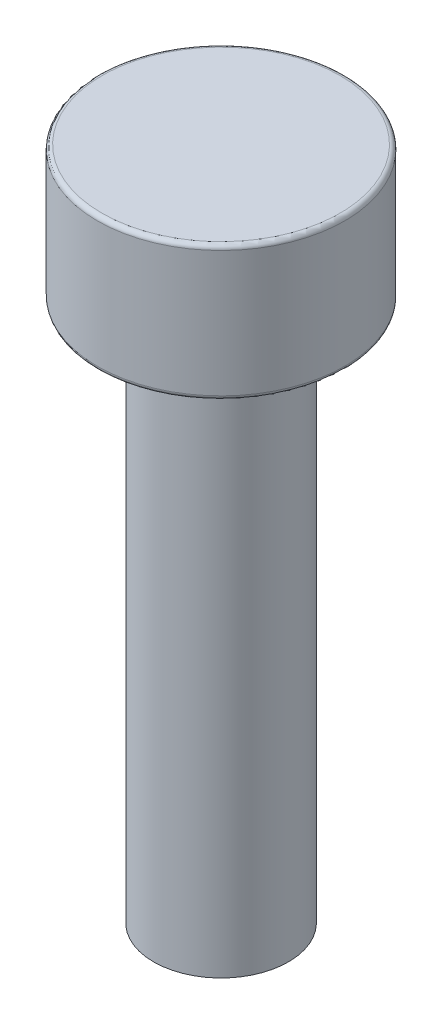
ISO-10303-21;
HEADER;
FILE_DESCRIPTION(('STEP AP214'),'2;1');
FILE_NAME('part.step','',(''),(''),'','','');
FILE_SCHEMA(('AUTOMOTIVE_DESIGN { 1 0 10303 214 1 1 1 1 }'));
ENDSEC;
DATA;
#1=APPLICATION_CONTEXT('core data for automotive mechanical design processes');
#2=APPLICATION_PROTOCOL_DEFINITION('international standard','automotive_design',2000,#1);
#3=PRODUCT_CONTEXT('',#1,'mechanical');
#4=PRODUCT('Part','Part','',(#3));
#5=PRODUCT_RELATED_PRODUCT_CATEGORY('part','',(#4));
#6=PRODUCT_DEFINITION_FORMATION('','',#4);
#7=PRODUCT_DEFINITION_CONTEXT('part definition',#1,'design');
#8=PRODUCT_DEFINITION('design','',#6,#7);
#9=PRODUCT_DEFINITION_SHAPE('','',#8);
#10=(LENGTH_UNIT() NAMED_UNIT(*) SI_UNIT(.MILLI.,.METRE.));
#11=(NAMED_UNIT(*) PLANE_ANGLE_UNIT() SI_UNIT($,.RADIAN.));
#12=(NAMED_UNIT(*) SI_UNIT($,.STERADIAN.) SOLID_ANGLE_UNIT());
#13=UNCERTAINTY_MEASURE_WITH_UNIT(LENGTH_MEASURE(1.E-05),#10,'distance_accuracy_value','');
#14=(GEOMETRIC_REPRESENTATION_CONTEXT(3) GLOBAL_UNCERTAINTY_ASSIGNED_CONTEXT((#13)) GLOBAL_UNIT_ASSIGNED_CONTEXT((#10,
#11,#12)) REPRESENTATION_CONTEXT('',''));
#15=CARTESIAN_POINT('',(0.,0.,0.));
#16=DIRECTION('',(0.,0.,1.));
#17=DIRECTION('',(1.,0.,0.));
#18=AXIS2_PLACEMENT_3D('',#15,#16,#17);
#19=CARTESIAN_POINT('',(0.,12.,0.));
#20=DIRECTION('',(0.,-1.,0.));
#21=DIRECTION('',(0.,0.,-1.));
#22=AXIS2_PLACEMENT_3D('',#19,#20,#21);
#23=CYLINDRICAL_SURFACE('',#22,1.5);
#24=CARTESIAN_POINT('',(0.,11.8,0.));
#25=DIRECTION('',(0.,1.,0.));
#26=DIRECTION('',(0.,0.,1.));
#27=AXIS2_PLACEMENT_3D('',#24,#25,#26);
#28=CIRCLE('',#27,1.5);
#29=CARTESIAN_POINT('',(0.,11.8,1.5));
#30=VERTEX_POINT('',#29);
#31=EDGE_CURVE('E57',#30,#30,#28,.F.);
#32=ORIENTED_EDGE('',*,*,#31,.T.);
#33=EDGE_LOOP('',(#32));
#34=FACE_BOUND('',#33,.T.);
#35=CARTESIAN_POINT('',(0.,0.,0.));
#36=DIRECTION('',(0.,1.,0.));
#37=DIRECTION('',(0.,0.,1.));
#38=AXIS2_PLACEMENT_3D('',#35,#36,#37);
#39=CIRCLE('',#38,1.5);
#40=CARTESIAN_POINT('',(0.,0.,1.5));
#41=VERTEX_POINT('',#40);
#42=EDGE_CURVE('E63',#41,#41,#39,.T.);
#43=ORIENTED_EDGE('',*,*,#42,.T.);
#44=EDGE_LOOP('',(#43));
#45=FACE_BOUND('',#44,.T.);
#46=ADVANCED_FACE('F37',(#34,#45),#23,.T.);
#47=CARTESIAN_POINT('',(0.,0.,0.));
#48=DIRECTION('',(0.,1.,0.));
#49=DIRECTION('',(0.,0.,1.));
#50=AXIS2_PLACEMENT_3D('',#47,#48,#49);
#51=PLANE('',#50);
#52=ORIENTED_EDGE('',*,*,#42,.F.);
#53=EDGE_LOOP('',(#52));
#54=FACE_BOUND('',#53,.T.);
#55=ADVANCED_FACE('F68',(#54),#51,.F.);
#56=CARTESIAN_POINT('',(0.,15.,0.));
#57=DIRECTION('',(0.,-1.,0.));
#58=DIRECTION('',(0.,0.,-1.));
#59=AXIS2_PLACEMENT_3D('',#56,#57,#58);
#60=CYLINDRICAL_SURFACE('',#59,2.75);
#61=CARTESIAN_POINT('',(0.,12.1,0.));
#62=DIRECTION('',(0.,1.,0.));
#63=DIRECTION('',(0.,0.,1.));
#64=AXIS2_PLACEMENT_3D('',#61,#62,#63);
#65=CIRCLE('',#64,2.75);
#66=CARTESIAN_POINT('',(0.,12.1,2.75));
#67=VERTEX_POINT('',#66);
#68=EDGE_CURVE('E44',#67,#67,#65,.T.);
#69=ORIENTED_EDGE('',*,*,#68,.T.);
#70=EDGE_LOOP('',(#69));
#71=FACE_BOUND('',#70,.T.);
#72=CARTESIAN_POINT('',(0.,14.9,0.));
#73=DIRECTION('',(0.,1.,0.));
#74=DIRECTION('',(0.,0.,1.));
#75=AXIS2_PLACEMENT_3D('',#72,#73,#74);
#76=CIRCLE('',#75,2.75);
#77=CARTESIAN_POINT('',(0.,14.9,2.75));
#78=VERTEX_POINT('',#77);
#79=EDGE_CURVE('E48',#78,#78,#76,.F.);
#80=ORIENTED_EDGE('',*,*,#79,.T.);
#81=EDGE_LOOP('',(#80));
#82=FACE_BOUND('',#81,.T.);
#83=ADVANCED_FACE('F70',(#71,#82),#60,.T.);
#84=CARTESIAN_POINT('',(0.,15.,0.));
#85=DIRECTION('',(0.,1.,0.));
#86=DIRECTION('',(0.,0.,1.));
#87=AXIS2_PLACEMENT_3D('',#84,#85,#86);
#88=PLANE('',#87);
#89=CARTESIAN_POINT('',(0.,15.,0.));
#90=DIRECTION('',(0.,1.,0.));
#91=DIRECTION('',(0.,0.,1.));
#92=AXIS2_PLACEMENT_3D('',#89,#90,#91);
#93=CIRCLE('',#92,2.65);
#94=CARTESIAN_POINT('',(0.,15.,2.65));
#95=VERTEX_POINT('',#94);
#96=EDGE_CURVE('E52',#95,#95,#93,.T.);
#97=ORIENTED_EDGE('',*,*,#96,.T.);
#98=EDGE_LOOP('',(#97));
#99=FACE_BOUND('',#98,.T.);
#100=ADVANCED_FACE('F76',(#99),#88,.T.);
#101=CARTESIAN_POINT('',(0.,12.,0.));
#102=DIRECTION('',(0.,1.,0.));
#103=DIRECTION('',(0.,0.,1.));
#104=AXIS2_PLACEMENT_3D('',#101,#102,#103);
#105=PLANE('',#104);
#106=CARTESIAN_POINT('',(0.,12.,0.));
#107=DIRECTION('',(0.,1.,0.));
#108=DIRECTION('',(0.,0.,1.));
#109=AXIS2_PLACEMENT_3D('',#106,#107,#108);
#110=CIRCLE('',#109,2.65);
#111=CARTESIAN_POINT('',(0.,12.,2.65));
#112=VERTEX_POINT('',#111);
#113=EDGE_CURVE('E10',#112,#112,#110,.F.);
#114=ORIENTED_EDGE('',*,*,#113,.T.);
#115=EDGE_LOOP('',(#114));
#116=FACE_BOUND('',#115,.T.);
#117=CARTESIAN_POINT('',(0.,12.,0.));
#118=DIRECTION('',(0.,1.,0.));
#119=DIRECTION('',(0.,0.,1.));
#120=AXIS2_PLACEMENT_3D('',#117,#118,#119);
#121=CIRCLE('',#120,1.7);
#122=CARTESIAN_POINT('',(0.,12.,1.7));
#123=VERTEX_POINT('',#122);
#124=EDGE_CURVE('E60',#123,#123,#121,.T.);
#125=ORIENTED_EDGE('',*,*,#124,.T.);
#126=EDGE_LOOP('',(#125));
#127=FACE_BOUND('',#126,.T.);
#128=ADVANCED_FACE('F85',(#116,#127),#105,.F.);
#129=CARTESIAN_POINT('',(0.,11.8,0.));
#130=DIRECTION('',(0.,1.,0.));
#131=DIRECTION('',(0.,0.,1.));
#132=AXIS2_PLACEMENT_3D('',#129,#130,#131);
#133=TOROIDAL_SURFACE('',#132,1.7,0.2);
#134=ORIENTED_EDGE('',*,*,#31,.F.);
#135=EDGE_LOOP('',(#134));
#136=FACE_BOUND('',#135,.T.);
#137=ORIENTED_EDGE('',*,*,#124,.F.);
#138=EDGE_LOOP('',(#137));
#139=FACE_BOUND('',#138,.T.);
#140=ADVANCED_FACE('F82',(#136,#139),#133,.F.);
#141=CARTESIAN_POINT('',(0.,14.9,0.));
#142=DIRECTION('',(0.,1.,0.));
#143=DIRECTION('',(0.,0.,1.));
#144=AXIS2_PLACEMENT_3D('',#141,#142,#143);
#145=TOROIDAL_SURFACE('',#144,2.65,0.1);
#146=ORIENTED_EDGE('',*,*,#79,.F.);
#147=EDGE_LOOP('',(#146));
#148=FACE_BOUND('',#147,.T.);
#149=ORIENTED_EDGE('',*,*,#96,.F.);
#150=EDGE_LOOP('',(#149));
#151=FACE_BOUND('',#150,.T.);
#152=ADVANCED_FACE('F84',(#148,#151),#145,.T.);
#153=CARTESIAN_POINT('',(0.,12.1,0.));
#154=DIRECTION('',(0.,1.,0.));
#155=DIRECTION('',(0.,0.,1.));
#156=AXIS2_PLACEMENT_3D('',#153,#154,#155);
#157=TOROIDAL_SURFACE('',#156,2.65,0.1);
#158=ORIENTED_EDGE('',*,*,#113,.F.);
#159=EDGE_LOOP('',(#158));
#160=FACE_BOUND('',#159,.T.);
#161=ORIENTED_EDGE('',*,*,#68,.F.);
#162=EDGE_LOOP('',(#161));
#163=FACE_BOUND('',#162,.T.);
#164=ADVANCED_FACE('F39',(#160,#163),#157,.T.);
#165=CLOSED_SHELL('',(#46,#55,#83,#100,#128,#140,#152,#164));
#166=MANIFOLD_SOLID_BREP('B2',#165);
#167=ADVANCED_BREP_SHAPE_REPRESENTATION('',(#18,#166),#14);
#168=SHAPE_DEFINITION_REPRESENTATION(#9,#167);
ENDSEC;
END-ISO-10303-21;
